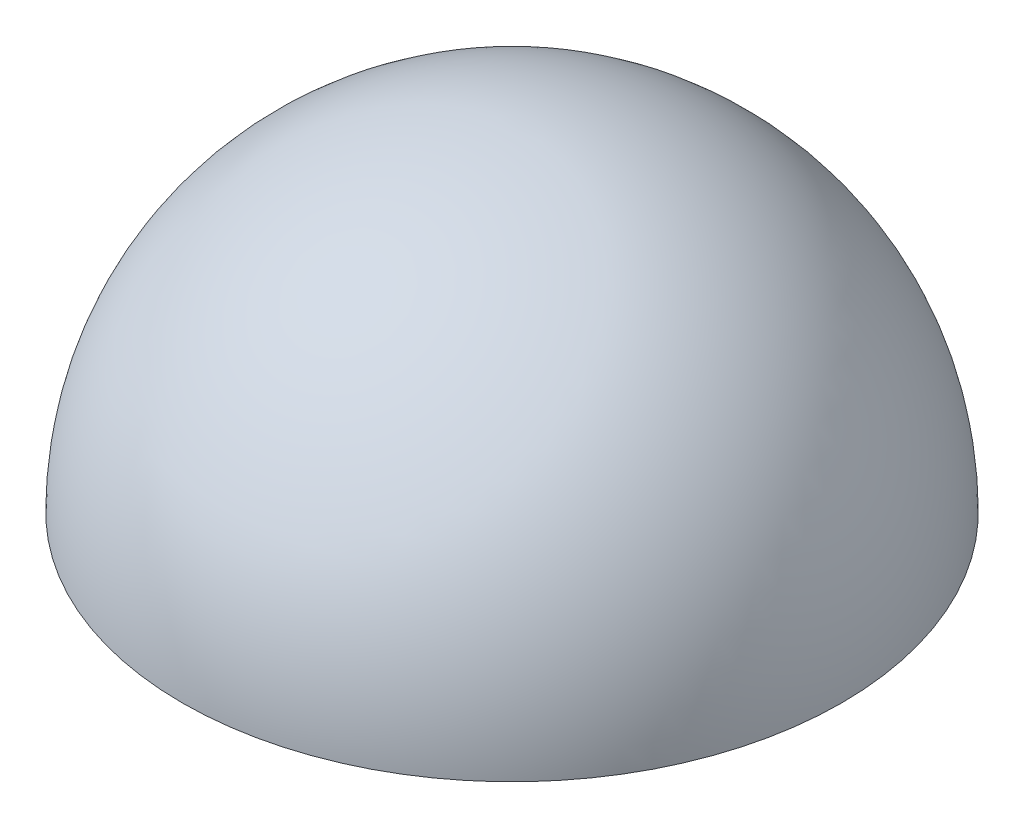
ISO-10303-21;
HEADER;
FILE_DESCRIPTION(('STEP AP214'),'2;1');
FILE_NAME('part.step','',(''),(''),'','','');
FILE_SCHEMA(('AUTOMOTIVE_DESIGN { 1 0 10303 214 1 1 1 1 }'));
ENDSEC;
DATA;
#1=APPLICATION_CONTEXT('core data for automotive mechanical design processes');
#2=APPLICATION_PROTOCOL_DEFINITION('international standard','automotive_design',2000,#1);
#3=PRODUCT_CONTEXT('',#1,'mechanical');
#4=PRODUCT('Part','Part','',(#3));
#5=PRODUCT_RELATED_PRODUCT_CATEGORY('part','',(#4));
#6=PRODUCT_DEFINITION_FORMATION('','',#4);
#7=PRODUCT_DEFINITION_CONTEXT('part definition',#1,'design');
#8=PRODUCT_DEFINITION('design','',#6,#7);
#9=PRODUCT_DEFINITION_SHAPE('','',#8);
#10=(LENGTH_UNIT() NAMED_UNIT(*) SI_UNIT(.MILLI.,.METRE.));
#11=(NAMED_UNIT(*) PLANE_ANGLE_UNIT() SI_UNIT($,.RADIAN.));
#12=(NAMED_UNIT(*) SI_UNIT($,.STERADIAN.) SOLID_ANGLE_UNIT());
#13=UNCERTAINTY_MEASURE_WITH_UNIT(LENGTH_MEASURE(1.E-05),#10,'distance_accuracy_value','');
#14=(GEOMETRIC_REPRESENTATION_CONTEXT(3) GLOBAL_UNCERTAINTY_ASSIGNED_CONTEXT((#13)) GLOBAL_UNIT_ASSIGNED_CONTEXT((#10,
#11,#12)) REPRESENTATION_CONTEXT('',''));
#15=CARTESIAN_POINT('',(0.,0.,0.));
#16=DIRECTION('',(0.,0.,1.));
#17=DIRECTION('',(1.,0.,0.));
#18=AXIS2_PLACEMENT_3D('',#15,#16,#17);
#19=CARTESIAN_POINT('',(0.,0.,0.));
#20=DIRECTION('',(0.,-1.,0.));
#21=DIRECTION('',(-1.,0.,0.));
#22=AXIS2_PLACEMENT_3D('',#19,#20,#21);
#23=SPHERICAL_SURFACE('',#22,12.7);
#24=CARTESIAN_POINT('',(0.,0.,0.));
#25=DIRECTION('',(0.,1.,0.));
#26=DIRECTION('',(0.,0.,1.));
#27=AXIS2_PLACEMENT_3D('',#24,#25,#26);
#28=CIRCLE('',#27,12.7);
#29=CARTESIAN_POINT('',(0.,0.,12.7));
#30=VERTEX_POINT('',#29);
#31=EDGE_CURVE('E10',#30,#30,#28,.T.);
#32=ORIENTED_EDGE('',*,*,#31,.T.);
#33=EDGE_LOOP('',(#32));
#34=FACE_BOUND('',#33,.T.);
#35=ADVANCED_FACE('F35',(#34),#23,.T.);
#36=CARTESIAN_POINT('',(0.,0.,0.));
#37=DIRECTION('',(0.,1.,0.));
#38=DIRECTION('',(0.,0.,-1.));
#39=AXIS2_PLACEMENT_3D('',#36,#37,#38);
#40=PLANE('',#39);
#41=ORIENTED_EDGE('',*,*,#31,.F.);
#42=EDGE_LOOP('',(#41));
#43=FACE_BOUND('',#42,.T.);
#44=ADVANCED_FACE('F43',(#43),#40,.F.);
#45=CLOSED_SHELL('',(#35,#44));
#46=MANIFOLD_SOLID_BREP('B2',#45);
#47=ADVANCED_BREP_SHAPE_REPRESENTATION('',(#18,#46),#14);
#48=SHAPE_DEFINITION_REPRESENTATION(#9,#47);
ENDSEC;
END-ISO-10303-21;
